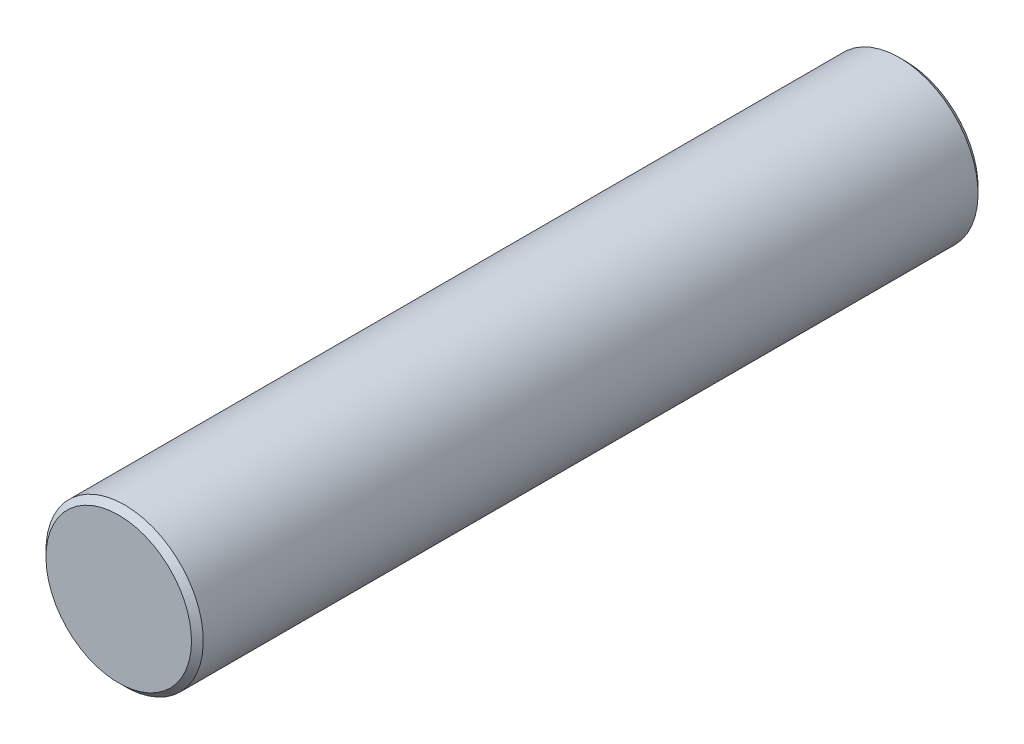
ISO-10303-21;
HEADER;
FILE_DESCRIPTION(('STEP AP214'),'2;1');
FILE_NAME('part.step','',(''),(''),'','','');
FILE_SCHEMA(('AUTOMOTIVE_DESIGN { 1 0 10303 214 1 1 1 1 }'));
ENDSEC;
DATA;
#1=APPLICATION_CONTEXT('core data for automotive mechanical design processes');
#2=APPLICATION_PROTOCOL_DEFINITION('international standard','automotive_design',2000,#1);
#3=PRODUCT_CONTEXT('',#1,'mechanical');
#4=PRODUCT('Part','Part','',(#3));
#5=PRODUCT_RELATED_PRODUCT_CATEGORY('part','',(#4));
#6=PRODUCT_DEFINITION_FORMATION('','',#4);
#7=PRODUCT_DEFINITION_CONTEXT('part definition',#1,'design');
#8=PRODUCT_DEFINITION('design','',#6,#7);
#9=PRODUCT_DEFINITION_SHAPE('','',#8);
#10=(LENGTH_UNIT() NAMED_UNIT(*) SI_UNIT(.MILLI.,.METRE.));
#11=(NAMED_UNIT(*) PLANE_ANGLE_UNIT() SI_UNIT($,.RADIAN.));
#12=(NAMED_UNIT(*) SI_UNIT($,.STERADIAN.) SOLID_ANGLE_UNIT());
#13=UNCERTAINTY_MEASURE_WITH_UNIT(LENGTH_MEASURE(1.E-05),#10,'distance_accuracy_value','');
#14=(GEOMETRIC_REPRESENTATION_CONTEXT(3) GLOBAL_UNCERTAINTY_ASSIGNED_CONTEXT((#13)) GLOBAL_UNIT_ASSIGNED_CONTEXT((#10,
#11,#12)) REPRESENTATION_CONTEXT('',''));
#15=CARTESIAN_POINT('',(0.,0.,0.));
#16=DIRECTION('',(0.,0.,1.));
#17=DIRECTION('',(1.,0.,0.));
#18=AXIS2_PLACEMENT_3D('',#15,#16,#17);
#19=CARTESIAN_POINT('',(0.,9.25,0.));
#20=DIRECTION('',(0.,0.,-1.));
#21=DIRECTION('',(0.,1.,0.));
#22=AXIS2_PLACEMENT_3D('',#19,#20,#21);
#23=PLANE('',#22);
#24=CARTESIAN_POINT('',(0.,0.,0.));
#25=DIRECTION('',(0.,0.,-1.));
#26=DIRECTION('',(0.,1.,0.));
#27=AXIS2_PLACEMENT_3D('',#24,#25,#26);
#28=CIRCLE('',#27,18.5);
#29=CARTESIAN_POINT('',(0.,18.5,0.));
#30=VERTEX_POINT('',#29);
#31=EDGE_CURVE('E9',#30,#30,#28,.T.);
#32=ORIENTED_EDGE('',*,*,#31,.T.);
#33=EDGE_LOOP('',(#32));
#34=FACE_BOUND('',#33,.T.);
#35=CARTESIAN_POINT('',(0.,0.,0.));
#36=DIRECTION('',(0.,0.,1.));
#37=DIRECTION('',(-1.,0.,0.));
#38=AXIS2_PLACEMENT_3D('',#35,#36,#37);
#39=CIRCLE('',#38,6.);
#40=CARTESIAN_POINT('',(-6.,0.,0.));
#41=VERTEX_POINT('',#40);
#42=EDGE_CURVE('E71',#41,#41,#39,.T.);
#43=ORIENTED_EDGE('',*,*,#42,.T.);
#44=EDGE_LOOP('',(#43));
#45=FACE_BOUND('',#44,.T.);
#46=ADVANCED_FACE('F15',(#34,#45),#23,.T.);
#47=CARTESIAN_POINT('',(0.,0.,0.75));
#48=DIRECTION('',(0.,0.,1.));
#49=DIRECTION('',(0.,1.,0.));
#50=AXIS2_PLACEMENT_3D('',#47,#48,#49);
#51=CONICAL_SURFACE('',#50,19.25,0.785398163397448);
#52=CARTESIAN_POINT('',(0.,0.,1.5));
#53=DIRECTION('',(0.,0.,-1.));
#54=DIRECTION('',(0.,1.,0.));
#55=AXIS2_PLACEMENT_3D('',#52,#53,#54);
#56=CIRCLE('',#55,20.);
#57=CARTESIAN_POINT('',(0.,20.,1.5));
#58=VERTEX_POINT('',#57);
#59=EDGE_CURVE('E25',#58,#58,#56,.T.);
#60=ORIENTED_EDGE('',*,*,#59,.T.);
#61=EDGE_LOOP('',(#60));
#62=FACE_BOUND('',#61,.T.);
#63=ORIENTED_EDGE('',*,*,#31,.F.);
#64=EDGE_LOOP('',(#63));
#65=FACE_BOUND('',#64,.T.);
#66=ADVANCED_FACE('F112',(#62,#65),#51,.T.);
#67=CARTESIAN_POINT('',(0.,0.,100.));
#68=DIRECTION('',(0.,0.,1.));
#69=DIRECTION('',(0.,1.,0.));
#70=AXIS2_PLACEMENT_3D('',#67,#68,#69);
#71=CYLINDRICAL_SURFACE('',#70,20.);
#72=CARTESIAN_POINT('',(0.,0.,198.5));
#73=DIRECTION('',(0.,0.,-1.));
#74=DIRECTION('',(0.,1.,0.));
#75=AXIS2_PLACEMENT_3D('',#72,#73,#74);
#76=CIRCLE('',#75,20.);
#77=CARTESIAN_POINT('',(0.,20.,198.5));
#78=VERTEX_POINT('',#77);
#79=EDGE_CURVE('E55',#78,#78,#76,.T.);
#80=ORIENTED_EDGE('',*,*,#79,.T.);
#81=EDGE_LOOP('',(#80));
#82=FACE_BOUND('',#81,.T.);
#83=ORIENTED_EDGE('',*,*,#59,.F.);
#84=EDGE_LOOP('',(#83));
#85=FACE_BOUND('',#84,.T.);
#86=CARTESIAN_POINT('',(0.,0.,6.5));
#87=DIRECTION('',(0.,0.,-1.));
#88=DIRECTION('',(0.,1.,0.));
#89=AXIS2_PLACEMENT_3D('',#86,#87,#88);
#90=CIRCLE('',#89,20.);
#91=CARTESIAN_POINT('',(10.5356537528527,-17.,6.5));
#92=VERTEX_POINT('',#91);
#93=CARTESIAN_POINT('',(-10.5356537528527,-17.,6.5));
#94=VERTEX_POINT('',#93);
#95=EDGE_CURVE('E70',#92,#94,#90,.T.);
#96=ORIENTED_EDGE('',*,*,#95,.T.);
#97=DIRECTION('',(0.,0.,1.));
#98=VECTOR('',#97,1.);
#99=CARTESIAN_POINT('',(-10.5356537528527,-17.,8.25));
#100=LINE('',#99,#98);
#101=CARTESIAN_POINT('',(-10.5356537528527,-17.,10.));
#102=VERTEX_POINT('',#101);
#103=EDGE_CURVE('E19',#94,#102,#100,.T.);
#104=ORIENTED_EDGE('',*,*,#103,.T.);
#105=CARTESIAN_POINT('',(0.,0.,10.));
#106=DIRECTION('',(0.,0.,1.));
#107=DIRECTION('',(0.,1.,0.));
#108=AXIS2_PLACEMENT_3D('',#105,#106,#107);
#109=CIRCLE('',#108,20.);
#110=CARTESIAN_POINT('',(10.5356537528527,-17.,10.));
#111=VERTEX_POINT('',#110);
#112=EDGE_CURVE('E66',#102,#111,#109,.T.);
#113=ORIENTED_EDGE('',*,*,#112,.T.);
#114=DIRECTION('',(0.,0.,-1.));
#115=VECTOR('',#114,1.);
#116=CARTESIAN_POINT('',(10.5356537528527,-17.,8.25));
#117=LINE('',#116,#115);
#118=EDGE_CURVE('E76',#111,#92,#117,.T.);
#119=ORIENTED_EDGE('',*,*,#118,.T.);
#120=EDGE_LOOP('',(#96,#104,#113,#119));
#121=FACE_BOUND('',#120,.T.);
#122=ADVANCED_FACE('F56',(#82,#85,#121),#71,.T.);
#123=CARTESIAN_POINT('',(0.,0.,199.25));
#124=DIRECTION('',(0.,0.,-1.));
#125=DIRECTION('',(0.,1.,0.));
#126=AXIS2_PLACEMENT_3D('',#123,#124,#125);
#127=CONICAL_SURFACE('',#126,19.25,0.785398163397448);
#128=CARTESIAN_POINT('',(0.,0.,200.));
#129=DIRECTION('',(0.,0.,-1.));
#130=DIRECTION('',(0.,1.,0.));
#131=AXIS2_PLACEMENT_3D('',#128,#129,#130);
#132=CIRCLE('',#131,18.5);
#133=CARTESIAN_POINT('',(0.,18.5,200.));
#134=VERTEX_POINT('',#133);
#135=EDGE_CURVE('E59',#134,#134,#132,.T.);
#136=ORIENTED_EDGE('',*,*,#135,.T.);
#137=EDGE_LOOP('',(#136));
#138=FACE_BOUND('',#137,.T.);
#139=ORIENTED_EDGE('',*,*,#79,.F.);
#140=EDGE_LOOP('',(#139));
#141=FACE_BOUND('',#140,.T.);
#142=ADVANCED_FACE('F17',(#138,#141),#127,.T.);
#143=CARTESIAN_POINT('',(0.,9.25,200.));
#144=DIRECTION('',(0.,0.,1.));
#145=DIRECTION('',(0.,-1.,0.));
#146=AXIS2_PLACEMENT_3D('',#143,#144,#145);
#147=PLANE('',#146);
#148=ORIENTED_EDGE('',*,*,#135,.F.);
#149=EDGE_LOOP('',(#148));
#150=FACE_BOUND('',#149,.T.);
#151=ADVANCED_FACE('F120',(#150),#147,.T.);
#152=CARTESIAN_POINT('',(0.,0.,26.4586213285198));
#153=DIRECTION('',(0.,0.,-1.));
#154=DIRECTION('',(-1.,0.,0.));
#155=AXIS2_PLACEMENT_3D('',#152,#153,#154);
#156=CONICAL_SURFACE('',#155,2.52640625,1.0471975511966);
#157=CARTESIAN_POINT('',(0.,0.,25.));
#158=DIRECTION('',(0.,0.,1.));
#159=DIRECTION('',(-1.,0.,0.));
#160=AXIS2_PLACEMENT_3D('',#157,#158,#159);
#161=CIRCLE('',#160,5.0528125);
#162=CARTESIAN_POINT('',(-5.0528125,0.,25.));
#163=VERTEX_POINT('',#162);
#164=EDGE_CURVE('E62',#163,#163,#161,.T.);
#165=ORIENTED_EDGE('',*,*,#164,.F.);
#166=EDGE_LOOP('',(#165));
#167=FACE_BOUND('',#166,.T.);
#168=CARTESIAN_POINT('',(0.,0.,27.9172426570397));
#169=VERTEX_POINT('',#168);
#170=VERTEX_LOOP('',#169);
#171=FACE_BOUND('',#170,.T.);
#172=ADVANCED_FACE('F122',(#167,#171),#156,.F.);
#173=CARTESIAN_POINT('',(0.,0.,12.97359375));
#174=DIRECTION('',(0.,0.,-1.));
#175=DIRECTION('',(-1.,0.,0.));
#176=AXIS2_PLACEMENT_3D('',#173,#174,#175);
#177=CYLINDRICAL_SURFACE('',#176,5.0528125);
#178=CARTESIAN_POINT('',(0.,0.,0.9471875));
#179=DIRECTION('',(0.,0.,1.));
#180=DIRECTION('',(-1.,0.,0.));
#181=AXIS2_PLACEMENT_3D('',#178,#179,#180);
#182=CIRCLE('',#181,5.0528125);
#183=CARTESIAN_POINT('',(-5.0528125,0.,0.9471875));
#184=VERTEX_POINT('',#183);
#185=EDGE_CURVE('E72',#184,#184,#182,.T.);
#186=ORIENTED_EDGE('',*,*,#185,.F.);
#187=EDGE_LOOP('',(#186));
#188=FACE_BOUND('',#187,.T.);
#189=ORIENTED_EDGE('',*,*,#164,.T.);
#190=EDGE_LOOP('',(#189));
#191=FACE_BOUND('',#190,.T.);
#192=ADVANCED_FACE('F128',(#188,#191),#177,.F.);
#193=CARTESIAN_POINT('',(0.,0.,0.47359375));
#194=DIRECTION('',(0.,0.,-1.));
#195=DIRECTION('',(-1.,0.,0.));
#196=AXIS2_PLACEMENT_3D('',#193,#194,#195);
#197=CONICAL_SURFACE('',#196,5.52640625,0.785398163397448);
#198=ORIENTED_EDGE('',*,*,#42,.F.);
#199=EDGE_LOOP('',(#198));
#200=FACE_BOUND('',#199,.T.);
#201=ORIENTED_EDGE('',*,*,#185,.T.);
#202=EDGE_LOOP('',(#201));
#203=FACE_BOUND('',#202,.T.);
#204=ADVANCED_FACE('F107',(#200,#203),#197,.F.);
#205=CARTESIAN_POINT('',(0.,-17.,8.25));
#206=DIRECTION('',(0.,-1.,0.));
#207=DIRECTION('',(0.,0.,-1.));
#208=AXIS2_PLACEMENT_3D('',#205,#206,#207);
#209=PLANE('',#208);
#210=ORIENTED_EDGE('',*,*,#103,.F.);
#211=DIRECTION('',(1.,0.,0.));
#212=VECTOR('',#211,1.);
#213=CARTESIAN_POINT('',(0.,-17.,6.5));
#214=LINE('',#213,#212);
#215=EDGE_CURVE('E83',#94,#92,#214,.T.);
#216=ORIENTED_EDGE('',*,*,#215,.T.);
#217=ORIENTED_EDGE('',*,*,#118,.F.);
#218=DIRECTION('',(-1.,0.,0.));
#219=VECTOR('',#218,1.);
#220=CARTESIAN_POINT('',(0.,-17.,10.));
#221=LINE('',#220,#219);
#222=EDGE_CURVE('E67',#111,#102,#221,.T.);
#223=ORIENTED_EDGE('',*,*,#222,.T.);
#224=EDGE_LOOP('',(#210,#216,#217,#223));
#225=FACE_BOUND('',#224,.T.);
#226=ADVANCED_FACE('F98',(#225),#209,.T.);
#227=CARTESIAN_POINT('',(0.,-19.5,6.5));
#228=DIRECTION('',(0.,0.,1.));
#229=DIRECTION('',(1.,0.,0.));
#230=AXIS2_PLACEMENT_3D('',#227,#228,#229);
#231=PLANE('',#230);
#232=ORIENTED_EDGE('',*,*,#95,.F.);
#233=ORIENTED_EDGE('',*,*,#215,.F.);
#234=EDGE_LOOP('',(#232,#233));
#235=FACE_BOUND('',#234,.T.);
#236=ADVANCED_FACE('F95',(#235),#231,.T.);
#237=CARTESIAN_POINT('',(0.,-19.5,10.));
#238=DIRECTION('',(0.,0.,1.));
#239=DIRECTION('',(1.,0.,0.));
#240=AXIS2_PLACEMENT_3D('',#237,#238,#239);
#241=PLANE('',#240);
#242=ORIENTED_EDGE('',*,*,#112,.F.);
#243=ORIENTED_EDGE('',*,*,#222,.F.);
#244=EDGE_LOOP('',(#242,#243));
#245=FACE_BOUND('',#244,.T.);
#246=ADVANCED_FACE('F97',(#245),#241,.F.);
#247=CLOSED_SHELL('',(#46,#66,#122,#142,#151,#172,#192,#204,#226,#236,#246));
#248=MANIFOLD_SOLID_BREP('B1',#247);
#249=ADVANCED_BREP_SHAPE_REPRESENTATION('',(#18,#248),#14);
#250=SHAPE_DEFINITION_REPRESENTATION(#9,#249);
ENDSEC;
END-ISO-10303-21;
